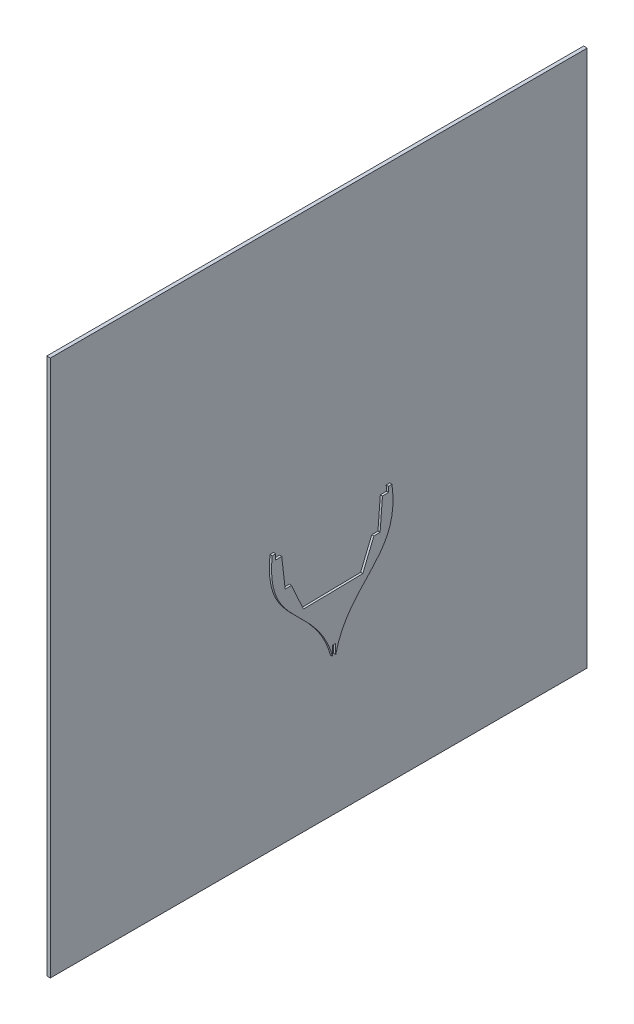
ISO-10303-21;
HEADER;
FILE_DESCRIPTION(('STEP AP214'),'2;1');
FILE_NAME('part.step','',(''),(''),'','','');
FILE_SCHEMA(('AUTOMOTIVE_DESIGN { 1 0 10303 214 1 1 1 1 }'));
ENDSEC;
DATA;
#1=APPLICATION_CONTEXT('core data for automotive mechanical design processes');
#2=APPLICATION_PROTOCOL_DEFINITION('international standard','automotive_design',2000,#1);
#3=PRODUCT_CONTEXT('',#1,'mechanical');
#4=PRODUCT('Part','Part','',(#3));
#5=PRODUCT_RELATED_PRODUCT_CATEGORY('part','',(#4));
#6=PRODUCT_DEFINITION_FORMATION('','',#4);
#7=PRODUCT_DEFINITION_CONTEXT('part definition',#1,'design');
#8=PRODUCT_DEFINITION('design','',#6,#7);
#9=PRODUCT_DEFINITION_SHAPE('','',#8);
#10=(LENGTH_UNIT() NAMED_UNIT(*) SI_UNIT(.MILLI.,.METRE.));
#11=(NAMED_UNIT(*) PLANE_ANGLE_UNIT() SI_UNIT($,.RADIAN.));
#12=(NAMED_UNIT(*) SI_UNIT($,.STERADIAN.) SOLID_ANGLE_UNIT());
#13=UNCERTAINTY_MEASURE_WITH_UNIT(LENGTH_MEASURE(1.E-05),#10,'distance_accuracy_value','');
#14=(GEOMETRIC_REPRESENTATION_CONTEXT(3) GLOBAL_UNCERTAINTY_ASSIGNED_CONTEXT((#13)) GLOBAL_UNIT_ASSIGNED_CONTEXT((#10,
#11,#12)) REPRESENTATION_CONTEXT('',''));
#15=CARTESIAN_POINT('',(0.,0.,0.));
#16=DIRECTION('',(0.,0.,1.));
#17=DIRECTION('',(1.,0.,0.));
#18=AXIS2_PLACEMENT_3D('',#15,#16,#17);
#19=CARTESIAN_POINT('',(6.,348.889604091465,173.769719303098));
#20=CARTESIAN_POINT('',(6.,138.917746092473,194.943304739467));
#21=CARTESIAN_POINT('',(6.,194.588665587905,26.6891998904036));
#22=CARTESIAN_POINT('',(6.,18.0649619587303,4.61229483232223));
#23=CARTESIAN_POINT('',(6.,0.,0.));
#24=B_SPLINE_CURVE_WITH_KNOTS('',4,(#19,#20,#21,#22,#23),.UNSPECIFIED.,.F.,.F.,(5,5),(0.,1.),.UNSPECIFIED.);
#25=DIRECTION('',(-1.,0.,0.));
#26=VECTOR('',#25,1.);
#27=SURFACE_OF_LINEAR_EXTRUSION('',#24,#26);
#28=CARTESIAN_POINT('',(0.,348.889604091465,173.769719303098));
#29=CARTESIAN_POINT('',(0.,138.917746092473,194.943304739467));
#30=CARTESIAN_POINT('',(0.,194.588665587905,26.6891998904036));
#31=CARTESIAN_POINT('',(0.,18.0649619587303,4.61229483232223));
#32=CARTESIAN_POINT('',(0.,0.,0.));
#33=B_SPLINE_CURVE_WITH_KNOTS('',4,(#28,#29,#30,#31,#32),.UNSPECIFIED.,.F.,.F.,(5,5),(0.,1.),.UNSPECIFIED.);
#34=CARTESIAN_POINT('',(0.,348.889604091465,173.769719303098));
#35=VERTEX_POINT('',#34);
#36=CARTESIAN_POINT('',(0.,21.2419165674728,4.88628208327476));
#37=VERTEX_POINT('',#36);
#38=EDGE_CURVE('E192',#35,#37,#33,.T.);
#39=ORIENTED_EDGE('',*,*,#38,.T.);
#40=DIRECTION('',(1.,0.,0.));
#41=VECTOR('',#40,1.);
#42=CARTESIAN_POINT('',(0.,21.2419165674728,4.88628208327476));
#43=LINE('',#42,#41);
#44=CARTESIAN_POINT('',(6.,21.2419165674728,4.88628208327476));
#45=VERTEX_POINT('',#44);
#46=EDGE_CURVE('E198',#37,#45,#43,.T.);
#47=ORIENTED_EDGE('',*,*,#46,.T.);
#48=CARTESIAN_POINT('',(6.,348.889604091465,173.769719303098));
#49=VERTEX_POINT('',#48);
#50=EDGE_CURVE('E232',#49,#45,#24,.T.);
#51=ORIENTED_EDGE('',*,*,#50,.F.);
#52=DIRECTION('',(-1.,0.,0.));
#53=VECTOR('',#52,1.);
#54=CARTESIAN_POINT('',(6.,348.889604091465,173.769719303098));
#55=LINE('',#54,#53);
#56=EDGE_CURVE('E188',#49,#35,#55,.T.);
#57=ORIENTED_EDGE('',*,*,#56,.T.);
#58=EDGE_LOOP('',(#39,#47,#51,#57));
#59=FACE_BOUND('',#58,.T.);
#60=ADVANCED_FACE('F45',(#59),#27,.F.);
#61=CARTESIAN_POINT('',(6.,0.,0.));
#62=CARTESIAN_POINT('',(6.,18.2201613043675,-3.95497613563854));
#63=CARTESIAN_POINT('',(6.,195.427644996334,-19.6239072882597));
#64=CARTESIAN_POINT('',(6.,145.887225547476,-189.783955233886));
#65=CARTESIAN_POINT('',(6.,354.954433821918,-161.01931902706));
#66=B_SPLINE_CURVE_WITH_KNOTS('',4,(#61,#62,#63,#64,#65),.UNSPECIFIED.,.F.,.F.,(5,5),(0.,1.),.UNSPECIFIED.);
#67=DIRECTION('',(-1.,0.,0.));
#68=VECTOR('',#67,1.);
#69=SURFACE_OF_LINEAR_EXTRUSION('',#66,#68);
#70=CARTESIAN_POINT('',(6.,21.4049549627749,-4.11371791672524));
#71=VERTEX_POINT('',#70);
#72=CARTESIAN_POINT('',(6.,354.954433821918,-161.01931902706));
#73=VERTEX_POINT('',#72);
#74=EDGE_CURVE('E128',#71,#73,#66,.T.);
#75=ORIENTED_EDGE('',*,*,#74,.F.);
#76=DIRECTION('',(1.,0.,0.));
#77=VECTOR('',#76,1.);
#78=CARTESIAN_POINT('',(0.,21.4049549627749,-4.11371791672524));
#79=LINE('',#78,#77);
#80=CARTESIAN_POINT('',(0.,21.4049549627749,-4.11371791672524));
#81=VERTEX_POINT('',#80);
#82=EDGE_CURVE('E322',#81,#71,#79,.T.);
#83=ORIENTED_EDGE('',*,*,#82,.F.);
#84=CARTESIAN_POINT('',(0.,0.,0.));
#85=CARTESIAN_POINT('',(0.,18.2201613043675,-3.95497613563854));
#86=CARTESIAN_POINT('',(0.,195.427644996334,-19.6239072882597));
#87=CARTESIAN_POINT('',(0.,145.887225547476,-189.783955233886));
#88=CARTESIAN_POINT('',(0.,354.954433821918,-161.01931902706));
#89=B_SPLINE_CURVE_WITH_KNOTS('',4,(#84,#85,#86,#87,#88),.UNSPECIFIED.,.F.,.F.,(5,5),(0.,1.),.UNSPECIFIED.);
#90=CARTESIAN_POINT('',(0.,354.954433821918,-161.01931902706));
#91=VERTEX_POINT('',#90);
#92=EDGE_CURVE('E197',#81,#91,#89,.T.);
#93=ORIENTED_EDGE('',*,*,#92,.T.);
#94=DIRECTION('',(-1.,0.,0.));
#95=VECTOR('',#94,1.);
#96=CARTESIAN_POINT('',(6.,354.954433821918,-161.01931902706));
#97=LINE('',#96,#95);
#98=EDGE_CURVE('E13',#73,#91,#97,.T.);
#99=ORIENTED_EDGE('',*,*,#98,.F.);
#100=EDGE_LOOP('',(#75,#83,#93,#99));
#101=FACE_BOUND('',#100,.T.);
#102=ADVANCED_FACE('F334',(#101),#69,.F.);
#103=CARTESIAN_POINT('',(6.,354.954433821918,-161.01931902706));
#104=DIRECTION('',(0.,-0.999835956927465,-0.0181124055536444));
#105=DIRECTION('',(0.,0.0181124055536444,-0.999835956927465));
#106=AXIS2_PLACEMENT_3D('',#103,#104,#105);
#107=PLANE('',#106);
#108=DIRECTION('',(0.,-0.0181124055536444,0.999835956927465));
#109=VECTOR('',#108,1.);
#110=CARTESIAN_POINT('',(0.,354.954433821918,-161.01931902706));
#111=LINE('',#110,#109);
#112=CARTESIAN_POINT('',(0.,354.773280049361,-151.01931902706));
#113=VERTEX_POINT('',#112);
#114=EDGE_CURVE('E205',#91,#113,#111,.T.);
#115=ORIENTED_EDGE('',*,*,#114,.T.);
#116=DIRECTION('',(-1.,0.,0.));
#117=VECTOR('',#116,1.);
#118=CARTESIAN_POINT('',(6.,354.773280049361,-151.01931902706));
#119=LINE('',#118,#117);
#120=CARTESIAN_POINT('',(6.,354.773280049361,-151.01931902706));
#121=VERTEX_POINT('',#120);
#122=EDGE_CURVE('E53',#121,#113,#119,.T.);
#123=ORIENTED_EDGE('',*,*,#122,.F.);
#124=DIRECTION('',(0.,-0.0181124055536444,0.999835956927465));
#125=VECTOR('',#124,1.);
#126=CARTESIAN_POINT('',(6.,354.954433821918,-161.01931902706));
#127=LINE('',#126,#125);
#128=EDGE_CURVE('E316',#73,#121,#127,.T.);
#129=ORIENTED_EDGE('',*,*,#128,.F.);
#130=ORIENTED_EDGE('',*,*,#98,.T.);
#131=EDGE_LOOP('',(#115,#123,#129,#130));
#132=FACE_BOUND('',#131,.T.);
#133=ADVANCED_FACE('F337',(#132),#107,.F.);
#134=CARTESIAN_POINT('',(6.,354.773280049361,-151.01931902706));
#135=DIRECTION('',(0.,0.0615422827320696,-0.998104477214748));
#136=DIRECTION('',(0.,0.998104477214748,0.0615422827320696));
#137=AXIS2_PLACEMENT_3D('',#134,#135,#136);
#138=PLANE('',#137);
#139=DIRECTION('',(0.,-0.998104477214748,-0.0615422827320696));
#140=VECTOR('',#139,1.);
#141=CARTESIAN_POINT('',(0.,354.773280049361,-151.01931902706));
#142=LINE('',#141,#140);
#143=CARTESIAN_POINT('',(0.,339.597201951874,-151.955063240577));
#144=VERTEX_POINT('',#143);
#145=EDGE_CURVE('E210',#113,#144,#142,.T.);
#146=ORIENTED_EDGE('',*,*,#145,.T.);
#147=DIRECTION('',(-1.,0.,0.));
#148=VECTOR('',#147,1.);
#149=CARTESIAN_POINT('',(6.,339.597201951874,-151.955063240577));
#150=LINE('',#149,#148);
#151=CARTESIAN_POINT('',(6.,339.597201951874,-151.955063240577));
#152=VERTEX_POINT('',#151);
#153=EDGE_CURVE('E257',#152,#144,#150,.T.);
#154=ORIENTED_EDGE('',*,*,#153,.F.);
#155=DIRECTION('',(0.,-0.998104477214748,-0.0615422827320696));
#156=VECTOR('',#155,1.);
#157=CARTESIAN_POINT('',(6.,354.773280049361,-151.01931902706));
#158=LINE('',#157,#156);
#159=EDGE_CURVE('E266',#121,#152,#158,.T.);
#160=ORIENTED_EDGE('',*,*,#159,.F.);
#161=ORIENTED_EDGE('',*,*,#122,.T.);
#162=EDGE_LOOP('',(#146,#154,#160,#161));
#163=FACE_BOUND('',#162,.T.);
#164=ADVANCED_FACE('F264',(#163),#138,.F.);
#165=CARTESIAN_POINT('',(6.,339.597201951874,-151.955063240577));
#166=DIRECTION('',(0.,-0.999835956927465,-0.0181124055536423));
#167=DIRECTION('',(0.,0.0181124055536423,-0.999835956927466));
#168=AXIS2_PLACEMENT_3D('',#165,#166,#167);
#169=PLANE('',#168);
#170=DIRECTION('',(0.,-0.0181124055536423,0.999835956927465));
#171=VECTOR('',#170,1.);
#172=CARTESIAN_POINT('',(0.,339.597201951874,-151.955063240577));
#173=LINE('',#172,#171);
#174=CARTESIAN_POINT('',(0.,339.282853519394,-134.602488792821));
#175=VERTEX_POINT('',#174);
#176=EDGE_CURVE('E212',#144,#175,#173,.T.);
#177=ORIENTED_EDGE('',*,*,#176,.T.);
#178=DIRECTION('',(-1.,0.,0.));
#179=VECTOR('',#178,1.);
#180=CARTESIAN_POINT('',(6.,339.282853519394,-134.602488792821));
#181=LINE('',#180,#179);
#182=CARTESIAN_POINT('',(6.,339.282853519394,-134.602488792821));
#183=VERTEX_POINT('',#182);
#184=EDGE_CURVE('E254',#183,#175,#181,.T.);
#185=ORIENTED_EDGE('',*,*,#184,.F.);
#186=DIRECTION('',(0.,-0.0181124055536423,0.999835956927465));
#187=VECTOR('',#186,1.);
#188=CARTESIAN_POINT('',(6.,339.597201951874,-151.955063240577));
#189=LINE('',#188,#187);
#190=EDGE_CURVE('E287',#152,#183,#189,.T.);
#191=ORIENTED_EDGE('',*,*,#190,.F.);
#192=ORIENTED_EDGE('',*,*,#153,.T.);
#193=EDGE_LOOP('',(#177,#185,#191,#192));
#194=FACE_BOUND('',#193,.T.);
#195=ADVANCED_FACE('F278',(#194),#169,.F.);
#196=CARTESIAN_POINT('',(6.,339.282853519394,-134.602488792821));
#197=DIRECTION('',(0.,-0.0779220815346801,-0.996959452139004));
#198=DIRECTION('',(0.,0.996959452139004,-0.0779220815346801));
#199=AXIS2_PLACEMENT_3D('',#196,#197,#198);
#200=PLANE('',#199);
#201=DIRECTION('',(0.,-0.996959452139004,0.0779220815346801));
#202=VECTOR('',#201,1.);
#203=CARTESIAN_POINT('',(0.,339.282853519394,-134.602488792821));
#204=LINE('',#203,#202);
#205=CARTESIAN_POINT('',(0.,254.940205778825,-128.01029022347));
#206=VERTEX_POINT('',#205);
#207=EDGE_CURVE('E214',#175,#206,#204,.T.);
#208=ORIENTED_EDGE('',*,*,#207,.T.);
#209=DIRECTION('',(-1.,0.,0.));
#210=VECTOR('',#209,1.);
#211=CARTESIAN_POINT('',(6.,254.940205778825,-128.01029022347));
#212=LINE('',#211,#210);
#213=CARTESIAN_POINT('',(6.,254.940205778825,-128.01029022347));
#214=VERTEX_POINT('',#213);
#215=EDGE_CURVE('E251',#214,#206,#212,.T.);
#216=ORIENTED_EDGE('',*,*,#215,.F.);
#217=DIRECTION('',(0.,-0.996959452139004,0.0779220815346801));
#218=VECTOR('',#217,1.);
#219=CARTESIAN_POINT('',(6.,339.282853519394,-134.602488792821));
#220=LINE('',#219,#218);
#221=EDGE_CURVE('E284',#183,#214,#220,.T.);
#222=ORIENTED_EDGE('',*,*,#221,.F.);
#223=ORIENTED_EDGE('',*,*,#184,.T.);
#224=EDGE_LOOP('',(#208,#216,#222,#223));
#225=FACE_BOUND('',#224,.T.);
#226=ADVANCED_FACE('F282',(#225),#200,.F.);
#227=CARTESIAN_POINT('',(6.,254.940205778825,-128.01029022347));
#228=DIRECTION('',(0.,-0.999835956927465,-0.0181124055536375));
#229=DIRECTION('',(0.,0.0181124055536375,-0.999835956927466));
#230=AXIS2_PLACEMENT_3D('',#227,#228,#229);
#231=PLANE('',#230);
#232=DIRECTION('',(0.,-0.0181124055536375,0.999835956927465));
#233=VECTOR('',#232,1.);
#234=CARTESIAN_POINT('',(0.,254.940205778825,-128.01029022347));
#235=LINE('',#234,#233);
#236=CARTESIAN_POINT('',(0.,254.624703577997,-110.594025777378));
#237=VERTEX_POINT('',#236);
#238=EDGE_CURVE('E216',#206,#237,#235,.T.);
#239=ORIENTED_EDGE('',*,*,#238,.T.);
#240=DIRECTION('',(-1.,0.,0.));
#241=VECTOR('',#240,1.);
#242=CARTESIAN_POINT('',(6.,254.624703577997,-110.594025777378));
#243=LINE('',#242,#241);
#244=CARTESIAN_POINT('',(6.,254.624703577997,-110.594025777378));
#245=VERTEX_POINT('',#244);
#246=EDGE_CURVE('E248',#245,#237,#243,.T.);
#247=ORIENTED_EDGE('',*,*,#246,.F.);
#248=DIRECTION('',(0.,-0.0181124055536375,0.999835956927465));
#249=VECTOR('',#248,1.);
#250=CARTESIAN_POINT('',(6.,254.940205778825,-128.01029022347));
#251=LINE('',#250,#249);
#252=EDGE_CURVE('E286',#214,#245,#251,.T.);
#253=ORIENTED_EDGE('',*,*,#252,.F.);
#254=ORIENTED_EDGE('',*,*,#215,.T.);
#255=EDGE_LOOP('',(#239,#247,#253,#254));
#256=FACE_BOUND('',#255,.T.);
#257=ADVANCED_FACE('F347',(#256),#231,.F.);
#258=CARTESIAN_POINT('',(6.,254.624703577997,-110.594025777378));
#259=DIRECTION('',(0.,-0.380765745288098,-0.924671534770699));
#260=DIRECTION('',(0.,0.924671534770699,-0.380765745288098));
#261=AXIS2_PLACEMENT_3D('',#258,#259,#260);
#262=PLANE('',#261);
#263=DIRECTION('',(0.,-0.924671534770699,0.380765745288098));
#264=VECTOR('',#263,1.);
#265=CARTESIAN_POINT('',(0.,254.624703577997,-110.594025777378));
#266=LINE('',#265,#264);
#267=CARTESIAN_POINT('',(0.,179.299786332998,-79.5763647214782));
#268=VERTEX_POINT('',#267);
#269=EDGE_CURVE('E218',#237,#268,#266,.T.);
#270=ORIENTED_EDGE('',*,*,#269,.T.);
#271=DIRECTION('',(-1.,0.,0.));
#272=VECTOR('',#271,1.);
#273=CARTESIAN_POINT('',(6.,179.299786332998,-79.5763647214782));
#274=LINE('',#273,#272);
#275=CARTESIAN_POINT('',(6.,179.299786332998,-79.5763647214782));
#276=VERTEX_POINT('',#275);
#277=EDGE_CURVE('E245',#276,#268,#274,.T.);
#278=ORIENTED_EDGE('',*,*,#277,.F.);
#279=DIRECTION('',(0.,-0.924671534770699,0.380765745288098));
#280=VECTOR('',#279,1.);
#281=CARTESIAN_POINT('',(6.,254.624703577997,-110.594025777378));
#282=LINE('',#281,#280);
#283=EDGE_CURVE('E289',#245,#276,#282,.T.);
#284=ORIENTED_EDGE('',*,*,#283,.F.);
#285=ORIENTED_EDGE('',*,*,#246,.T.);
#286=EDGE_LOOP('',(#270,#278,#284,#285));
#287=FACE_BOUND('',#286,.T.);
#288=ADVANCED_FACE('F350',(#287),#262,.F.);
#289=CARTESIAN_POINT('',(6.,179.299786332998,-79.5763647214782));
#290=DIRECTION('',(0.,-0.999835956927465,-0.0181124055536428));
#291=DIRECTION('',(0.,0.0181124055536428,-0.999835956927466));
#292=AXIS2_PLACEMENT_3D('',#289,#290,#291);
#293=PLANE('',#292);
#294=DIRECTION('',(0.,-0.0181124055536428,0.999835956927465));
#295=VECTOR('',#294,1.);
#296=CARTESIAN_POINT('',(0.,179.299786332998,-79.5763647214782));
#297=LINE('',#296,#295);
#298=CARTESIAN_POINT('',(0.,176.299978527822,86.0181886140013));
#299=VERTEX_POINT('',#298);
#300=EDGE_CURVE('E220',#268,#299,#297,.T.);
#301=ORIENTED_EDGE('',*,*,#300,.T.);
#302=DIRECTION('',(-1.,0.,0.));
#303=VECTOR('',#302,1.);
#304=CARTESIAN_POINT('',(6.,176.299978527822,86.0181886140013));
#305=LINE('',#304,#303);
#306=CARTESIAN_POINT('',(6.,176.299978527822,86.0181886140013));
#307=VERTEX_POINT('',#306);
#308=EDGE_CURVE('E242',#307,#299,#305,.T.);
#309=ORIENTED_EDGE('',*,*,#308,.F.);
#310=DIRECTION('',(0.,-0.0181124055536428,0.999835956927465));
#311=VECTOR('',#310,1.);
#312=CARTESIAN_POINT('',(6.,179.299786332998,-79.5763647214782));
#313=LINE('',#312,#311);
#314=EDGE_CURVE('E295',#276,#307,#313,.T.);
#315=ORIENTED_EDGE('',*,*,#314,.F.);
#316=ORIENTED_EDGE('',*,*,#277,.T.);
#317=EDGE_LOOP('',(#301,#309,#315,#316));
#318=FACE_BOUND('',#317,.T.);
#319=ADVANCED_FACE('F354',(#318),#293,.F.);
#320=CARTESIAN_POINT('',(6.,250.452049110893,119.743681695466));
#321=DIRECTION('',(0.,-0.414006474738033,0.910273936172505));
#322=DIRECTION('',(0.,-0.910273936172506,-0.414006474738033));
#323=AXIS2_PLACEMENT_3D('',#320,#321,#322);
#324=PLANE('',#323);
#325=DIRECTION('',(0.,0.910273936172505,0.414006474738033));
#326=VECTOR('',#325,1.);
#327=CARTESIAN_POINT('',(0.,250.452049110893,119.743681695466));
#328=LINE('',#327,#326);
#329=CARTESIAN_POINT('',(0.,250.452049110893,119.743681695466));
#330=VERTEX_POINT('',#329);
#331=EDGE_CURVE('E222',#299,#330,#328,.T.);
#332=ORIENTED_EDGE('',*,*,#331,.T.);
#333=DIRECTION('',(-1.,0.,0.));
#334=VECTOR('',#333,1.);
#335=CARTESIAN_POINT('',(6.,250.452049110893,119.743681695466));
#336=LINE('',#335,#334);
#337=CARTESIAN_POINT('',(6.,250.452049110893,119.743681695466));
#338=VERTEX_POINT('',#337);
#339=EDGE_CURVE('E239',#338,#330,#336,.T.);
#340=ORIENTED_EDGE('',*,*,#339,.F.);
#341=DIRECTION('',(0.,0.910273936172505,0.414006474738033));
#342=VECTOR('',#341,1.);
#343=CARTESIAN_POINT('',(6.,250.452049110893,119.743681695466));
#344=LINE('',#343,#342);
#345=EDGE_CURVE('E297',#307,#338,#344,.T.);
#346=ORIENTED_EDGE('',*,*,#345,.F.);
#347=ORIENTED_EDGE('',*,*,#308,.T.);
#348=EDGE_LOOP('',(#332,#340,#346,#347));
#349=FACE_BOUND('',#348,.T.);
#350=ADVANCED_FACE('F358',(#349),#324,.F.);
#351=CARTESIAN_POINT('',(6.,250.136546910066,137.159946141558));
#352=DIRECTION('',(0.,-0.999835956927465,-0.0181124055536438));
#353=DIRECTION('',(0.,0.0181124055536438,-0.999835956927466));
#354=AXIS2_PLACEMENT_3D('',#351,#352,#353);
#355=PLANE('',#354);
#356=DIRECTION('',(0.,-0.0181124055536438,0.999835956927465));
#357=VECTOR('',#356,1.);
#358=CARTESIAN_POINT('',(0.,250.136546910066,137.159946141558));
#359=LINE('',#358,#357);
#360=CARTESIAN_POINT('',(0.,250.136546910066,137.159946141558));
#361=VERTEX_POINT('',#360);
#362=EDGE_CURVE('E224',#330,#361,#359,.T.);
#363=ORIENTED_EDGE('',*,*,#362,.T.);
#364=DIRECTION('',(-1.,0.,0.));
#365=VECTOR('',#364,1.);
#366=CARTESIAN_POINT('',(6.,250.136546910066,137.159946141558));
#367=LINE('',#366,#365);
#368=CARTESIAN_POINT('',(6.,250.136546910066,137.159946141558));
#369=VERTEX_POINT('',#368);
#370=EDGE_CURVE('E236',#369,#361,#367,.T.);
#371=ORIENTED_EDGE('',*,*,#370,.F.);
#372=DIRECTION('',(0.,-0.0181124055536438,0.999835956927465));
#373=VECTOR('',#372,1.);
#374=CARTESIAN_POINT('',(6.,250.136546910066,137.159946141558));
#375=LINE('',#374,#373);
#376=EDGE_CURVE('E299',#338,#369,#375,.T.);
#377=ORIENTED_EDGE('',*,*,#376,.F.);
#378=ORIENTED_EDGE('',*,*,#339,.T.);
#379=EDGE_LOOP('',(#363,#371,#377,#378));
#380=FACE_BOUND('',#379,.T.);
#381=ADVANCED_FACE('F305',(#380),#355,.F.);
#382=CARTESIAN_POINT('',(6.,334.185093907371,146.802614730138));
#383=DIRECTION('',(0.,-0.113979698892057,0.993483078990516));
#384=DIRECTION('',(0.,-0.993483078990516,-0.113979698892057));
#385=AXIS2_PLACEMENT_3D('',#382,#383,#384);
#386=PLANE('',#385);
#387=DIRECTION('',(0.,0.993483078990516,0.113979698892057));
#388=VECTOR('',#387,1.);
#389=CARTESIAN_POINT('',(0.,334.185093907371,146.802614730138));
#390=LINE('',#389,#388);
#391=CARTESIAN_POINT('',(0.,334.185093907371,146.802614730138));
#392=VERTEX_POINT('',#391);
#393=EDGE_CURVE('E226',#361,#392,#390,.T.);
#394=ORIENTED_EDGE('',*,*,#393,.T.);
#395=DIRECTION('',(-1.,0.,0.));
#396=VECTOR('',#395,1.);
#397=CARTESIAN_POINT('',(6.,334.185093907371,146.802614730138));
#398=LINE('',#397,#396);
#399=CARTESIAN_POINT('',(6.,334.185093907371,146.802614730138));
#400=VERTEX_POINT('',#399);
#401=EDGE_CURVE('E183',#400,#392,#398,.T.);
#402=ORIENTED_EDGE('',*,*,#401,.F.);
#403=DIRECTION('',(0.,0.993483078990516,0.113979698892057));
#404=VECTOR('',#403,1.);
#405=CARTESIAN_POINT('',(6.,334.185093907371,146.802614730138));
#406=LINE('',#405,#404);
#407=EDGE_CURVE('E171',#369,#400,#406,.T.);
#408=ORIENTED_EDGE('',*,*,#407,.F.);
#409=ORIENTED_EDGE('',*,*,#370,.T.);
#410=EDGE_LOOP('',(#394,#402,#408,#409));
#411=FACE_BOUND('',#410,.T.);
#412=ADVANCED_FACE('F309',(#411),#386,.F.);
#413=CARTESIAN_POINT('',(6.,333.870745474891,164.155189177894));
#414=DIRECTION('',(0.,-0.999835956927465,-0.0181124055536358));
#415=DIRECTION('',(0.,0.0181124055536358,-0.999835956927466));
#416=AXIS2_PLACEMENT_3D('',#413,#414,#415);
#417=PLANE('',#416);
#418=DIRECTION('',(0.,-0.0181124055536358,0.999835956927466));
#419=VECTOR('',#418,1.);
#420=CARTESIAN_POINT('',(0.,333.870745474891,164.155189177894));
#421=LINE('',#420,#419);
#422=CARTESIAN_POINT('',(0.,333.870745474891,164.155189177894));
#423=VERTEX_POINT('',#422);
#424=EDGE_CURVE('E180',#392,#423,#421,.T.);
#425=ORIENTED_EDGE('',*,*,#424,.T.);
#426=DIRECTION('',(-1.,0.,0.));
#427=VECTOR('',#426,1.);
#428=CARTESIAN_POINT('',(6.,333.870745474891,164.155189177894));
#429=LINE('',#428,#427);
#430=CARTESIAN_POINT('',(6.,333.870745474891,164.155189177894));
#431=VERTEX_POINT('',#430);
#432=EDGE_CURVE('E177',#431,#423,#429,.T.);
#433=ORIENTED_EDGE('',*,*,#432,.F.);
#434=DIRECTION('',(0.,-0.0181124055536358,0.999835956927466));
#435=VECTOR('',#434,1.);
#436=CARTESIAN_POINT('',(6.,333.870745474891,164.155189177894));
#437=LINE('',#436,#435);
#438=EDGE_CURVE('E163',#400,#431,#437,.T.);
#439=ORIENTED_EDGE('',*,*,#438,.F.);
#440=ORIENTED_EDGE('',*,*,#401,.T.);
#441=EDGE_LOOP('',(#425,#433,#439,#440));
#442=FACE_BOUND('',#441,.T.);
#443=ADVANCED_FACE('F178',(#442),#417,.F.);
#444=CARTESIAN_POINT('',(6.,349.070757864023,163.769719303098));
#445=DIRECTION('',(0.,0.0253516887165551,0.999678594288794));
#446=DIRECTION('',(0.,-0.999678594288794,0.0253516887165551));
#447=AXIS2_PLACEMENT_3D('',#444,#445,#446);
#448=PLANE('',#447);
#449=DIRECTION('',(0.,0.999678594288794,-0.0253516887165551));
#450=VECTOR('',#449,1.);
#451=CARTESIAN_POINT('',(0.,349.070757864023,163.769719303098));
#452=LINE('',#451,#450);
#453=CARTESIAN_POINT('',(0.,349.070757864023,163.769719303098));
#454=VERTEX_POINT('',#453);
#455=EDGE_CURVE('E229',#423,#454,#452,.T.);
#456=ORIENTED_EDGE('',*,*,#455,.T.);
#457=DIRECTION('',(-1.,0.,0.));
#458=VECTOR('',#457,1.);
#459=CARTESIAN_POINT('',(6.,349.070757864023,163.769719303098));
#460=LINE('',#459,#458);
#461=CARTESIAN_POINT('',(6.,349.070757864023,163.769719303098));
#462=VERTEX_POINT('',#461);
#463=EDGE_CURVE('E184',#462,#454,#460,.T.);
#464=ORIENTED_EDGE('',*,*,#463,.F.);
#465=DIRECTION('',(0.,0.999678594288794,-0.0253516887165551));
#466=VECTOR('',#465,1.);
#467=CARTESIAN_POINT('',(6.,349.070757864023,163.769719303098));
#468=LINE('',#467,#466);
#469=EDGE_CURVE('E168',#431,#462,#468,.T.);
#470=ORIENTED_EDGE('',*,*,#469,.F.);
#471=ORIENTED_EDGE('',*,*,#432,.T.);
#472=EDGE_LOOP('',(#456,#464,#470,#471));
#473=FACE_BOUND('',#472,.T.);
#474=ADVANCED_FACE('F186',(#473),#448,.F.);
#475=CARTESIAN_POINT('',(6.,348.889604091465,173.769719303098));
#476=DIRECTION('',(0.,-0.999835956927465,-0.0181124055536503));
#477=DIRECTION('',(0.,0.0181124055536503,-0.999835956927465));
#478=AXIS2_PLACEMENT_3D('',#475,#476,#477);
#479=PLANE('',#478);
#480=DIRECTION('',(0.,-0.0181124055536503,0.999835956927465));
#481=VECTOR('',#480,1.);
#482=CARTESIAN_POINT('',(0.,348.889604091465,173.769719303098));
#483=LINE('',#482,#481);
#484=EDGE_CURVE('E120',#454,#35,#483,.T.);
#485=ORIENTED_EDGE('',*,*,#484,.T.);
#486=ORIENTED_EDGE('',*,*,#56,.F.);
#487=DIRECTION('',(0.,-0.0181124055536503,0.999835956927465));
#488=VECTOR('',#487,1.);
#489=CARTESIAN_POINT('',(6.,348.889604091465,173.769719303098));
#490=LINE('',#489,#488);
#491=EDGE_CURVE('E69',#462,#49,#490,.T.);
#492=ORIENTED_EDGE('',*,*,#491,.F.);
#493=ORIENTED_EDGE('',*,*,#463,.T.);
#494=EDGE_LOOP('',(#485,#486,#492,#493));
#495=FACE_BOUND('',#494,.T.);
#496=ADVANCED_FACE('F311',(#495),#479,.F.);
#497=CARTESIAN_POINT('',(6.,134.022026863982,70.7579573082923));
#498=DIRECTION('',(1.,0.,0.));
#499=DIRECTION('',(0.,0.,-1.));
#500=AXIS2_PLACEMENT_3D('',#497,#498,#499);
#501=PLANE('',#500);
#502=DIRECTION('',(0.,-0.999835956927465,-0.0181124055536429));
#503=VECTOR('',#502,1.);
#504=CARTESIAN_POINT('',(6.,21.2419165674728,4.88628208327476));
#505=LINE('',#504,#503);
#506=CARTESIAN_POINT('',(6.,48.2419165674728,5.37539726918104));
#507=VERTEX_POINT('',#506);
#508=EDGE_CURVE('E510',#507,#45,#505,.T.);
#509=ORIENTED_EDGE('',*,*,#508,.F.);
#510=DIRECTION('',(0.,-0.0181124055536438,0.999835956927465));
#511=VECTOR('',#510,1.);
#512=CARTESIAN_POINT('',(6.,48.2419165674728,5.37539726918104));
#513=LINE('',#512,#511);
#514=CARTESIAN_POINT('',(6.,48.4049549627749,-3.62460273081896));
#515=VERTEX_POINT('',#514);
#516=EDGE_CURVE('E519',#515,#507,#513,.T.);
#517=ORIENTED_EDGE('',*,*,#516,.F.);
#518=DIRECTION('',(0.,0.999835956927465,0.0181124055536428));
#519=VECTOR('',#518,1.);
#520=CARTESIAN_POINT('',(6.,48.4049549627749,-3.62460273081896));
#521=LINE('',#520,#519);
#522=EDGE_CURVE('E523',#71,#515,#521,.T.);
#523=ORIENTED_EDGE('',*,*,#522,.F.);
#524=ORIENTED_EDGE('',*,*,#74,.T.);
#525=ORIENTED_EDGE('',*,*,#128,.T.);
#526=ORIENTED_EDGE('',*,*,#159,.T.);
#527=ORIENTED_EDGE('',*,*,#190,.T.);
#528=ORIENTED_EDGE('',*,*,#221,.T.);
#529=ORIENTED_EDGE('',*,*,#252,.T.);
#530=ORIENTED_EDGE('',*,*,#283,.T.);
#531=ORIENTED_EDGE('',*,*,#314,.T.);
#532=ORIENTED_EDGE('',*,*,#345,.T.);
#533=ORIENTED_EDGE('',*,*,#376,.T.);
#534=ORIENTED_EDGE('',*,*,#407,.T.);
#535=ORIENTED_EDGE('',*,*,#438,.T.);
#536=ORIENTED_EDGE('',*,*,#469,.T.);
#537=ORIENTED_EDGE('',*,*,#491,.T.);
#538=ORIENTED_EDGE('',*,*,#50,.T.);
#539=EDGE_LOOP('',(#509,#517,#523,#524,#525,#526,#527,#528,#529,#530,#531,#532,#533,#534,#535,
#536,#537,#538));
#540=FACE_BOUND('',#539,.T.);
#541=ADVANCED_FACE('F166',(#540),#501,.T.);
#542=CARTESIAN_POINT('',(0.,134.022026863982,70.7579573082923));
#543=DIRECTION('',(1.,0.,0.));
#544=DIRECTION('',(0.,0.,-1.));
#545=AXIS2_PLACEMENT_3D('',#542,#543,#544);
#546=PLANE('',#545);
#547=DIRECTION('',(0.,-0.0181124055536438,0.999835956927465));
#548=VECTOR('',#547,1.);
#549=CARTESIAN_POINT('',(0.,48.2419165674728,5.37539726918104));
#550=LINE('',#549,#548);
#551=CARTESIAN_POINT('',(0.,48.4049549627749,-3.62460273081897));
#552=VERTEX_POINT('',#551);
#553=CARTESIAN_POINT('',(0.,48.2419165674728,5.37539726918104));
#554=VERTEX_POINT('',#553);
#555=EDGE_CURVE('E60',#552,#554,#550,.T.);
#556=ORIENTED_EDGE('',*,*,#555,.T.);
#557=DIRECTION('',(0.,-0.999835956927465,-0.0181124055536429));
#558=VECTOR('',#557,1.);
#559=CARTESIAN_POINT('',(0.,21.2419165674728,4.88628208327476));
#560=LINE('',#559,#558);
#561=EDGE_CURVE('E532',#554,#37,#560,.T.);
#562=ORIENTED_EDGE('',*,*,#561,.T.);
#563=ORIENTED_EDGE('',*,*,#38,.F.);
#564=ORIENTED_EDGE('',*,*,#484,.F.);
#565=ORIENTED_EDGE('',*,*,#455,.F.);
#566=ORIENTED_EDGE('',*,*,#424,.F.);
#567=ORIENTED_EDGE('',*,*,#393,.F.);
#568=ORIENTED_EDGE('',*,*,#362,.F.);
#569=ORIENTED_EDGE('',*,*,#331,.F.);
#570=ORIENTED_EDGE('',*,*,#300,.F.);
#571=ORIENTED_EDGE('',*,*,#269,.F.);
#572=ORIENTED_EDGE('',*,*,#238,.F.);
#573=ORIENTED_EDGE('',*,*,#207,.F.);
#574=ORIENTED_EDGE('',*,*,#176,.F.);
#575=ORIENTED_EDGE('',*,*,#145,.F.);
#576=ORIENTED_EDGE('',*,*,#114,.F.);
#577=ORIENTED_EDGE('',*,*,#92,.F.);
#578=DIRECTION('',(0.,0.999835956927465,0.0181124055536428));
#579=VECTOR('',#578,1.);
#580=CARTESIAN_POINT('',(0.,48.4049549627749,-3.62460273081896));
#581=LINE('',#580,#579);
#582=EDGE_CURVE('E518',#81,#552,#581,.T.);
#583=ORIENTED_EDGE('',*,*,#582,.T.);
#584=EDGE_LOOP('',(#556,#562,#563,#564,#565,#566,#567,#568,#569,#570,#571,#572,#573,#574,#575,
#576,#577,#583));
#585=FACE_BOUND('',#584,.T.);
#586=ADVANCED_FACE('F272',(#585),#546,.F.);
#587=CARTESIAN_POINT('',(0.,21.2419165674728,4.88628208327476));
#588=DIRECTION('',(0.,-0.0181124055536429,0.999835956927465));
#589=DIRECTION('',(0.,-0.999835956927466,-0.0181124055536429));
#590=AXIS2_PLACEMENT_3D('',#587,#588,#589);
#591=PLANE('',#590);
#592=ORIENTED_EDGE('',*,*,#508,.T.);
#593=ORIENTED_EDGE('',*,*,#46,.F.);
#594=ORIENTED_EDGE('',*,*,#561,.F.);
#595=DIRECTION('',(1.,0.,0.));
#596=VECTOR('',#595,1.);
#597=CARTESIAN_POINT('',(0.,48.2419165674728,5.37539726918104));
#598=LINE('',#597,#596);
#599=EDGE_CURVE('E514',#554,#507,#598,.T.);
#600=ORIENTED_EDGE('',*,*,#599,.T.);
#601=EDGE_LOOP('',(#592,#593,#594,#600));
#602=FACE_BOUND('',#601,.T.);
#603=ADVANCED_FACE('F375',(#602),#591,.F.);
#604=CARTESIAN_POINT('',(0.,48.2419165674728,5.37539726918104));
#605=DIRECTION('',(0.,0.999835956927465,0.0181124055536438));
#606=DIRECTION('',(0.,-0.0181124055536438,0.999835956927466));
#607=AXIS2_PLACEMENT_3D('',#604,#605,#606);
#608=PLANE('',#607);
#609=ORIENTED_EDGE('',*,*,#516,.T.);
#610=ORIENTED_EDGE('',*,*,#599,.F.);
#611=ORIENTED_EDGE('',*,*,#555,.F.);
#612=DIRECTION('',(1.,0.,0.));
#613=VECTOR('',#612,1.);
#614=CARTESIAN_POINT('',(0.,48.4049549627749,-3.62460273081896));
#615=LINE('',#614,#613);
#616=EDGE_CURVE('E528',#552,#515,#615,.T.);
#617=ORIENTED_EDGE('',*,*,#616,.T.);
#618=EDGE_LOOP('',(#609,#610,#611,#617));
#619=FACE_BOUND('',#618,.T.);
#620=ADVANCED_FACE('F381',(#619),#608,.F.);
#621=CARTESIAN_POINT('',(0.,48.4049549627749,-3.62460273081896));
#622=DIRECTION('',(0.,0.0181124055536428,-0.999835956927465));
#623=DIRECTION('',(0.,0.999835956927466,0.0181124055536428));
#624=AXIS2_PLACEMENT_3D('',#621,#622,#623);
#625=PLANE('',#624);
#626=ORIENTED_EDGE('',*,*,#522,.T.);
#627=ORIENTED_EDGE('',*,*,#616,.F.);
#628=ORIENTED_EDGE('',*,*,#582,.F.);
#629=ORIENTED_EDGE('',*,*,#82,.T.);
#630=EDGE_LOOP('',(#626,#627,#628,#629));
#631=FACE_BOUND('',#630,.T.);
#632=ADVANCED_FACE('F378',(#631),#625,.F.);
#633=CLOSED_SHELL('',(#60,#102,#133,#164,#195,#226,#257,#288,#319,#350,#381,#412,#443,#474,#496,
#541,#586,#603,#620,#632));
#634=MANIFOLD_SOLID_BREP('B2',#633);
#635=CARTESIAN_POINT('',(-10.,0.,0.));
#636=DIRECTION('',(-1.,0.,0.));
#637=DIRECTION('',(0.,0.,1.));
#638=AXIS2_PLACEMENT_3D('',#635,#636,#637);
#639=PLANE('',#638);
#640=DIRECTION('',(0.,0.,-1.));
#641=VECTOR('',#640,1.);
#642=CARTESIAN_POINT('',(-10.,-378.710653275796,777.274991403029));
#643=LINE('',#642,#641);
#644=CARTESIAN_POINT('',(-10.,-378.710653275796,777.274991403029));
#645=VERTEX_POINT('',#644);
#646=CARTESIAN_POINT('',(-10.,-378.710653275796,-722.725008596971));
#647=VERTEX_POINT('',#646);
#648=EDGE_CURVE('E563',#645,#647,#643,.T.);
#649=ORIENTED_EDGE('',*,*,#648,.T.);
#650=DIRECTION('',(0.,-1.,0.));
#651=VECTOR('',#650,1.);
#652=CARTESIAN_POINT('',(-10.,1121.2893467242,-722.725008596971));
#653=LINE('',#652,#651);
#654=CARTESIAN_POINT('',(-10.,1121.2893467242,-722.725008596971));
#655=VERTEX_POINT('',#654);
#656=EDGE_CURVE('E597',#655,#647,#653,.T.);
#657=ORIENTED_EDGE('',*,*,#656,.F.);
#658=DIRECTION('',(0.,0.,-1.));
#659=VECTOR('',#658,1.);
#660=CARTESIAN_POINT('',(-10.,1121.2893467242,777.274991403029));
#661=LINE('',#660,#659);
#662=CARTESIAN_POINT('',(-10.,1121.2893467242,777.274991403029));
#663=VERTEX_POINT('',#662);
#664=EDGE_CURVE('E594',#663,#655,#661,.T.);
#665=ORIENTED_EDGE('',*,*,#664,.F.);
#666=DIRECTION('',(0.,-1.,0.));
#667=VECTOR('',#666,1.);
#668=CARTESIAN_POINT('',(-10.,1121.2893467242,777.274991403029));
#669=LINE('',#668,#667);
#670=EDGE_CURVE('E591',#663,#645,#669,.T.);
#671=ORIENTED_EDGE('',*,*,#670,.T.);
#672=EDGE_LOOP('',(#649,#657,#665,#671));
#673=FACE_BOUND('',#672,.T.);
#674=ADVANCED_FACE('F554',(#673),#639,.F.);
#675=CARTESIAN_POINT('',(-20.,0.,0.));
#676=DIRECTION('',(-1.,0.,0.));
#677=DIRECTION('',(0.,0.,1.));
#678=AXIS2_PLACEMENT_3D('',#675,#676,#677);
#679=PLANE('',#678);
#680=DIRECTION('',(0.,0.,-1.));
#681=VECTOR('',#680,1.);
#682=CARTESIAN_POINT('',(-20.,-378.710653275796,777.274991403029));
#683=LINE('',#682,#681);
#684=CARTESIAN_POINT('',(-20.,-378.710653275796,777.274991403029));
#685=VERTEX_POINT('',#684);
#686=CARTESIAN_POINT('',(-20.,-378.710653275796,-722.725008596971));
#687=VERTEX_POINT('',#686);
#688=EDGE_CURVE('E43',#685,#687,#683,.T.);
#689=ORIENTED_EDGE('',*,*,#688,.F.);
#690=DIRECTION('',(0.,-1.,0.));
#691=VECTOR('',#690,1.);
#692=CARTESIAN_POINT('',(-20.,1121.2893467242,777.274991403029));
#693=LINE('',#692,#691);
#694=CARTESIAN_POINT('',(-20.,1121.2893467242,777.274991403029));
#695=VERTEX_POINT('',#694);
#696=EDGE_CURVE('E610',#695,#685,#693,.T.);
#697=ORIENTED_EDGE('',*,*,#696,.F.);
#698=DIRECTION('',(0.,0.,-1.));
#699=VECTOR('',#698,1.);
#700=CARTESIAN_POINT('',(-20.,1121.2893467242,777.274991403029));
#701=LINE('',#700,#699);
#702=CARTESIAN_POINT('',(-20.,1121.2893467242,-722.725008596971));
#703=VERTEX_POINT('',#702);
#704=EDGE_CURVE('E601',#695,#703,#701,.T.);
#705=ORIENTED_EDGE('',*,*,#704,.T.);
#706=DIRECTION('',(0.,-1.,0.));
#707=VECTOR('',#706,1.);
#708=CARTESIAN_POINT('',(-20.,1121.2893467242,-722.725008596971));
#709=LINE('',#708,#707);
#710=EDGE_CURVE('E572',#703,#687,#709,.T.);
#711=ORIENTED_EDGE('',*,*,#710,.T.);
#712=EDGE_LOOP('',(#689,#697,#705,#711));
#713=FACE_BOUND('',#712,.T.);
#714=ADVANCED_FACE('F650',(#713),#679,.T.);
#715=CARTESIAN_POINT('',(-20.,1121.2893467242,777.274991403029));
#716=DIRECTION('',(0.,0.,1.));
#717=DIRECTION('',(1.,0.,0.));
#718=AXIS2_PLACEMENT_3D('',#715,#716,#717);
#719=PLANE('',#718);
#720=ORIENTED_EDGE('',*,*,#670,.F.);
#721=DIRECTION('',(1.,0.,0.));
#722=VECTOR('',#721,1.);
#723=CARTESIAN_POINT('',(-20.,1121.2893467242,777.274991403029));
#724=LINE('',#723,#722);
#725=EDGE_CURVE('E606',#695,#663,#724,.T.);
#726=ORIENTED_EDGE('',*,*,#725,.F.);
#727=ORIENTED_EDGE('',*,*,#696,.T.);
#728=DIRECTION('',(1.,0.,0.));
#729=VECTOR('',#728,1.);
#730=CARTESIAN_POINT('',(-20.,-378.710653275796,777.274991403029));
#731=LINE('',#730,#729);
#732=EDGE_CURVE('E602',#685,#645,#731,.T.);
#733=ORIENTED_EDGE('',*,*,#732,.T.);
#734=EDGE_LOOP('',(#720,#726,#727,#733));
#735=FACE_BOUND('',#734,.T.);
#736=ADVANCED_FACE('F611',(#735),#719,.T.);
#737=CARTESIAN_POINT('',(-20.,-378.710653275796,777.274991403029));
#738=DIRECTION('',(0.,-1.,0.));
#739=DIRECTION('',(0.,0.,-1.));
#740=AXIS2_PLACEMENT_3D('',#737,#738,#739);
#741=PLANE('',#740);
#742=ORIENTED_EDGE('',*,*,#648,.F.);
#743=ORIENTED_EDGE('',*,*,#732,.F.);
#744=ORIENTED_EDGE('',*,*,#688,.T.);
#745=DIRECTION('',(1.,0.,0.));
#746=VECTOR('',#745,1.);
#747=CARTESIAN_POINT('',(-20.,-378.710653275796,-722.725008596971));
#748=LINE('',#747,#746);
#749=EDGE_CURVE('E622',#687,#647,#748,.T.);
#750=ORIENTED_EDGE('',*,*,#749,.T.);
#751=EDGE_LOOP('',(#742,#743,#744,#750));
#752=FACE_BOUND('',#751,.T.);
#753=ADVANCED_FACE('F652',(#752),#741,.T.);
#754=CARTESIAN_POINT('',(-20.,1121.2893467242,777.274991403029));
#755=DIRECTION('',(0.,-1.,0.));
#756=DIRECTION('',(0.,0.,-1.));
#757=AXIS2_PLACEMENT_3D('',#754,#755,#756);
#758=PLANE('',#757);
#759=ORIENTED_EDGE('',*,*,#664,.T.);
#760=DIRECTION('',(1.,0.,0.));
#761=VECTOR('',#760,1.);
#762=CARTESIAN_POINT('',(-20.,1121.2893467242,-722.725008596971));
#763=LINE('',#762,#761);
#764=EDGE_CURVE('E626',#703,#655,#763,.T.);
#765=ORIENTED_EDGE('',*,*,#764,.F.);
#766=ORIENTED_EDGE('',*,*,#704,.F.);
#767=ORIENTED_EDGE('',*,*,#725,.T.);
#768=EDGE_LOOP('',(#759,#765,#766,#767));
#769=FACE_BOUND('',#768,.T.);
#770=ADVANCED_FACE('F607',(#769),#758,.F.);
#771=CARTESIAN_POINT('',(-20.,1121.2893467242,-722.725008596971));
#772=DIRECTION('',(0.,0.,1.));
#773=DIRECTION('',(1.,0.,0.));
#774=AXIS2_PLACEMENT_3D('',#771,#772,#773);
#775=PLANE('',#774);
#776=ORIENTED_EDGE('',*,*,#656,.T.);
#777=ORIENTED_EDGE('',*,*,#749,.F.);
#778=ORIENTED_EDGE('',*,*,#710,.F.);
#779=ORIENTED_EDGE('',*,*,#764,.T.);
#780=EDGE_LOOP('',(#776,#777,#778,#779));
#781=FACE_BOUND('',#780,.T.);
#782=ADVANCED_FACE('F637',(#781),#775,.F.);
#783=CLOSED_SHELL('',(#674,#714,#736,#753,#770,#782));
#784=MANIFOLD_SOLID_BREP('B7_NOT_SHOWN',#783);
#785=ADVANCED_BREP_SHAPE_REPRESENTATION('',(#18,#634,#784),#14);
#786=SHAPE_DEFINITION_REPRESENTATION(#9,#785);
ENDSEC;
END-ISO-10303-21;
